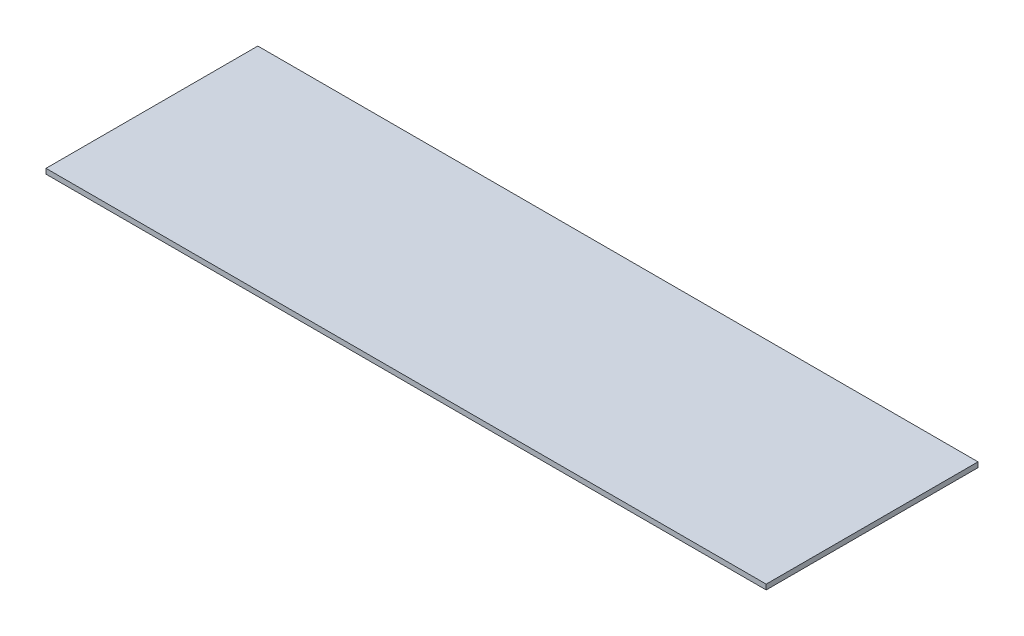
ISO-10303-21;
HEADER;
FILE_DESCRIPTION(('STEP AP214'),'2;1');
FILE_NAME('part.step','',(''),(''),'','','');
FILE_SCHEMA(('AUTOMOTIVE_DESIGN { 1 0 10303 214 1 1 1 1 }'));
ENDSEC;
DATA;
#1=APPLICATION_CONTEXT('core data for automotive mechanical design processes');
#2=APPLICATION_PROTOCOL_DEFINITION('international standard','automotive_design',2000,#1);
#3=PRODUCT_CONTEXT('',#1,'mechanical');
#4=PRODUCT('Part','Part','',(#3));
#5=PRODUCT_RELATED_PRODUCT_CATEGORY('part','',(#4));
#6=PRODUCT_DEFINITION_FORMATION('','',#4);
#7=PRODUCT_DEFINITION_CONTEXT('part definition',#1,'design');
#8=PRODUCT_DEFINITION('design','',#6,#7);
#9=PRODUCT_DEFINITION_SHAPE('','',#8);
#10=(LENGTH_UNIT() NAMED_UNIT(*) SI_UNIT(.MILLI.,.METRE.));
#11=(NAMED_UNIT(*) PLANE_ANGLE_UNIT() SI_UNIT($,.RADIAN.));
#12=(NAMED_UNIT(*) SI_UNIT($,.STERADIAN.) SOLID_ANGLE_UNIT());
#13=UNCERTAINTY_MEASURE_WITH_UNIT(LENGTH_MEASURE(1.E-05),#10,'distance_accuracy_value','');
#14=(GEOMETRIC_REPRESENTATION_CONTEXT(3) GLOBAL_UNCERTAINTY_ASSIGNED_CONTEXT((#13)) GLOBAL_UNIT_ASSIGNED_CONTEXT((#10,
#11,#12)) REPRESENTATION_CONTEXT('',''));
#15=CARTESIAN_POINT('',(0.,0.,0.));
#16=DIRECTION('',(0.,0.,1.));
#17=DIRECTION('',(1.,0.,0.));
#18=AXIS2_PLACEMENT_3D('',#15,#16,#17);
#19=CARTESIAN_POINT('',(-850.,12.,250.));
#20=DIRECTION('',(1.,0.,0.));
#21=DIRECTION('',(0.,0.,-1.));
#22=AXIS2_PLACEMENT_3D('',#19,#20,#21);
#23=PLANE('',#22);
#24=DIRECTION('',(0.,0.,1.));
#25=VECTOR('',#24,1.);
#26=CARTESIAN_POINT('',(-850.,0.,250.));
#27=LINE('',#26,#25);
#28=CARTESIAN_POINT('',(-850.,0.,-250.));
#29=VERTEX_POINT('',#28);
#30=CARTESIAN_POINT('',(-850.,0.,250.));
#31=VERTEX_POINT('',#30);
#32=EDGE_CURVE('E105',#29,#31,#27,.T.);
#33=ORIENTED_EDGE('',*,*,#32,.T.);
#34=DIRECTION('',(0.,-1.,0.));
#35=VECTOR('',#34,1.);
#36=CARTESIAN_POINT('',(-850.,12.,250.));
#37=LINE('',#36,#35);
#38=CARTESIAN_POINT('',(-850.,12.,250.));
#39=VERTEX_POINT('',#38);
#40=EDGE_CURVE('E11',#39,#31,#37,.T.);
#41=ORIENTED_EDGE('',*,*,#40,.F.);
#42=DIRECTION('',(0.,0.,1.));
#43=VECTOR('',#42,1.);
#44=CARTESIAN_POINT('',(-850.,12.,250.));
#45=LINE('',#44,#43);
#46=CARTESIAN_POINT('',(-850.,12.,-250.));
#47=VERTEX_POINT('',#46);
#48=EDGE_CURVE('E89',#47,#39,#45,.T.);
#49=ORIENTED_EDGE('',*,*,#48,.F.);
#50=DIRECTION('',(0.,-1.,0.));
#51=VECTOR('',#50,1.);
#52=CARTESIAN_POINT('',(-850.,12.,-250.));
#53=LINE('',#52,#51);
#54=EDGE_CURVE('E97',#47,#29,#53,.T.);
#55=ORIENTED_EDGE('',*,*,#54,.T.);
#56=EDGE_LOOP('',(#33,#41,#49,#55));
#57=FACE_BOUND('',#56,.T.);
#58=ADVANCED_FACE('F39',(#57),#23,.F.);
#59=CARTESIAN_POINT('',(850.,12.,250.));
#60=DIRECTION('',(0.,0.,-1.));
#61=DIRECTION('',(-1.,0.,0.));
#62=AXIS2_PLACEMENT_3D('',#59,#60,#61);
#63=PLANE('',#62);
#64=DIRECTION('',(1.,0.,0.));
#65=VECTOR('',#64,1.);
#66=CARTESIAN_POINT('',(850.,0.,250.));
#67=LINE('',#66,#65);
#68=CARTESIAN_POINT('',(850.,0.,250.));
#69=VERTEX_POINT('',#68);
#70=EDGE_CURVE('E92',#31,#69,#67,.T.);
#71=ORIENTED_EDGE('',*,*,#70,.T.);
#72=DIRECTION('',(0.,-1.,0.));
#73=VECTOR('',#72,1.);
#74=CARTESIAN_POINT('',(850.,12.,250.));
#75=LINE('',#74,#73);
#76=CARTESIAN_POINT('',(850.,12.,250.));
#77=VERTEX_POINT('',#76);
#78=EDGE_CURVE('E50',#77,#69,#75,.T.);
#79=ORIENTED_EDGE('',*,*,#78,.F.);
#80=DIRECTION('',(1.,0.,0.));
#81=VECTOR('',#80,1.);
#82=CARTESIAN_POINT('',(850.,12.,250.));
#83=LINE('',#82,#81);
#84=EDGE_CURVE('E82',#39,#77,#83,.T.);
#85=ORIENTED_EDGE('',*,*,#84,.F.);
#86=ORIENTED_EDGE('',*,*,#40,.T.);
#87=EDGE_LOOP('',(#71,#79,#85,#86));
#88=FACE_BOUND('',#87,.T.);
#89=ADVANCED_FACE('F93',(#88),#63,.F.);
#90=CARTESIAN_POINT('',(850.,12.,250.));
#91=DIRECTION('',(-1.,0.,0.));
#92=DIRECTION('',(0.,0.,1.));
#93=AXIS2_PLACEMENT_3D('',#90,#91,#92);
#94=PLANE('',#93);
#95=DIRECTION('',(0.,0.,-1.));
#96=VECTOR('',#95,1.);
#97=CARTESIAN_POINT('',(850.,0.,250.));
#98=LINE('',#97,#96);
#99=CARTESIAN_POINT('',(850.,0.,-250.));
#100=VERTEX_POINT('',#99);
#101=EDGE_CURVE('E72',#69,#100,#98,.T.);
#102=ORIENTED_EDGE('',*,*,#101,.T.);
#103=DIRECTION('',(0.,-1.,0.));
#104=VECTOR('',#103,1.);
#105=CARTESIAN_POINT('',(850.,12.,-250.));
#106=LINE('',#105,#104);
#107=CARTESIAN_POINT('',(850.,12.,-250.));
#108=VERTEX_POINT('',#107);
#109=EDGE_CURVE('E94',#108,#100,#106,.T.);
#110=ORIENTED_EDGE('',*,*,#109,.F.);
#111=DIRECTION('',(0.,0.,-1.));
#112=VECTOR('',#111,1.);
#113=CARTESIAN_POINT('',(850.,12.,250.));
#114=LINE('',#113,#112);
#115=EDGE_CURVE('E88',#77,#108,#114,.T.);
#116=ORIENTED_EDGE('',*,*,#115,.F.);
#117=ORIENTED_EDGE('',*,*,#78,.T.);
#118=EDGE_LOOP('',(#102,#110,#116,#117));
#119=FACE_BOUND('',#118,.T.);
#120=ADVANCED_FACE('F96',(#119),#94,.F.);
#121=CARTESIAN_POINT('',(850.,12.,-250.));
#122=DIRECTION('',(0.,0.,1.));
#123=DIRECTION('',(1.,0.,0.));
#124=AXIS2_PLACEMENT_3D('',#121,#122,#123);
#125=PLANE('',#124);
#126=DIRECTION('',(-1.,0.,0.));
#127=VECTOR('',#126,1.);
#128=CARTESIAN_POINT('',(850.,0.,-250.));
#129=LINE('',#128,#127);
#130=EDGE_CURVE('E76',#100,#29,#129,.T.);
#131=ORIENTED_EDGE('',*,*,#130,.T.);
#132=ORIENTED_EDGE('',*,*,#54,.F.);
#133=DIRECTION('',(-1.,0.,0.));
#134=VECTOR('',#133,1.);
#135=CARTESIAN_POINT('',(850.,12.,-250.));
#136=LINE('',#135,#134);
#137=EDGE_CURVE('E54',#108,#47,#136,.T.);
#138=ORIENTED_EDGE('',*,*,#137,.F.);
#139=ORIENTED_EDGE('',*,*,#109,.T.);
#140=EDGE_LOOP('',(#131,#132,#138,#139));
#141=FACE_BOUND('',#140,.T.);
#142=ADVANCED_FACE('F108',(#141),#125,.F.);
#143=CARTESIAN_POINT('',(0.,12.,0.));
#144=DIRECTION('',(0.,1.,0.));
#145=DIRECTION('',(0.,0.,1.));
#146=AXIS2_PLACEMENT_3D('',#143,#144,#145);
#147=PLANE('',#146);
#148=ORIENTED_EDGE('',*,*,#48,.T.);
#149=ORIENTED_EDGE('',*,*,#84,.T.);
#150=ORIENTED_EDGE('',*,*,#115,.T.);
#151=ORIENTED_EDGE('',*,*,#137,.T.);
#152=EDGE_LOOP('',(#148,#149,#150,#151));
#153=FACE_BOUND('',#152,.T.);
#154=ADVANCED_FACE('F86',(#153),#147,.T.);
#155=CARTESIAN_POINT('',(0.,0.,0.));
#156=DIRECTION('',(0.,1.,0.));
#157=DIRECTION('',(0.,0.,1.));
#158=AXIS2_PLACEMENT_3D('',#155,#156,#157);
#159=PLANE('',#158);
#160=ORIENTED_EDGE('',*,*,#32,.F.);
#161=ORIENTED_EDGE('',*,*,#130,.F.);
#162=ORIENTED_EDGE('',*,*,#101,.F.);
#163=ORIENTED_EDGE('',*,*,#70,.F.);
#164=EDGE_LOOP('',(#160,#161,#162,#163));
#165=FACE_BOUND('',#164,.T.);
#166=ADVANCED_FACE('F115',(#165),#159,.F.);
#167=CLOSED_SHELL('',(#58,#89,#120,#142,#154,#166));
#168=MANIFOLD_SOLID_BREP('B2',#167);
#169=ADVANCED_BREP_SHAPE_REPRESENTATION('',(#18,#168),#14);
#170=SHAPE_DEFINITION_REPRESENTATION(#9,#169);
ENDSEC;
END-ISO-10303-21;
